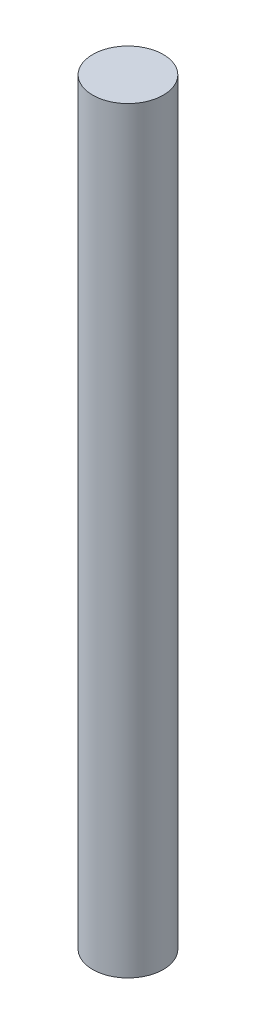
ISO-10303-21;
HEADER;
FILE_DESCRIPTION(('STEP AP214'),'2;1');
FILE_NAME('part.step','',(''),(''),'','','');
FILE_SCHEMA(('AUTOMOTIVE_DESIGN { 1 0 10303 214 1 1 1 1 }'));
ENDSEC;
DATA;
#1=APPLICATION_CONTEXT('core data for automotive mechanical design processes');
#2=APPLICATION_PROTOCOL_DEFINITION('international standard','automotive_design',2000,#1);
#3=PRODUCT_CONTEXT('',#1,'mechanical');
#4=PRODUCT('Part','Part','',(#3));
#5=PRODUCT_RELATED_PRODUCT_CATEGORY('part','',(#4));
#6=PRODUCT_DEFINITION_FORMATION('','',#4);
#7=PRODUCT_DEFINITION_CONTEXT('part definition',#1,'design');
#8=PRODUCT_DEFINITION('design','',#6,#7);
#9=PRODUCT_DEFINITION_SHAPE('','',#8);
#10=(LENGTH_UNIT() NAMED_UNIT(*) SI_UNIT(.MILLI.,.METRE.));
#11=(NAMED_UNIT(*) PLANE_ANGLE_UNIT() SI_UNIT($,.RADIAN.));
#12=(NAMED_UNIT(*) SI_UNIT($,.STERADIAN.) SOLID_ANGLE_UNIT());
#13=UNCERTAINTY_MEASURE_WITH_UNIT(LENGTH_MEASURE(1.E-05),#10,'distance_accuracy_value','');
#14=(GEOMETRIC_REPRESENTATION_CONTEXT(3) GLOBAL_UNCERTAINTY_ASSIGNED_CONTEXT((#13)) GLOBAL_UNIT_ASSIGNED_CONTEXT((#10,
#11,#12)) REPRESENTATION_CONTEXT('',''));
#15=CARTESIAN_POINT('',(0.,0.,0.));
#16=DIRECTION('',(0.,0.,1.));
#17=DIRECTION('',(1.,0.,0.));
#18=AXIS2_PLACEMENT_3D('',#15,#16,#17);
#19=CARTESIAN_POINT('',(0.,32.2,0.));
#20=DIRECTION('',(0.,-1.,0.));
#21=DIRECTION('',(0.,0.,-1.));
#22=AXIS2_PLACEMENT_3D('',#19,#20,#21);
#23=CYLINDRICAL_SURFACE('',#22,1.5);
#24=CARTESIAN_POINT('',(0.,32.2,0.));
#25=DIRECTION('',(0.,1.,0.));
#26=DIRECTION('',(0.,0.,1.));
#27=AXIS2_PLACEMENT_3D('',#24,#25,#26);
#28=CIRCLE('',#27,1.5);
#29=CARTESIAN_POINT('',(0.,32.2,1.5));
#30=VERTEX_POINT('',#29);
#31=EDGE_CURVE('E10',#30,#30,#28,.T.);
#32=ORIENTED_EDGE('',*,*,#31,.F.);
#33=EDGE_LOOP('',(#32));
#34=FACE_BOUND('',#33,.T.);
#35=CARTESIAN_POINT('',(0.,0.,0.));
#36=DIRECTION('',(0.,1.,0.));
#37=DIRECTION('',(0.,0.,1.));
#38=AXIS2_PLACEMENT_3D('',#35,#36,#37);
#39=CIRCLE('',#38,1.5);
#40=CARTESIAN_POINT('',(0.,0.,1.5));
#41=VERTEX_POINT('',#40);
#42=EDGE_CURVE('E34',#41,#41,#39,.T.);
#43=ORIENTED_EDGE('',*,*,#42,.T.);
#44=EDGE_LOOP('',(#43));
#45=FACE_BOUND('',#44,.T.);
#46=ADVANCED_FACE('F31',(#34,#45),#23,.T.);
#47=CARTESIAN_POINT('',(0.,32.2,0.));
#48=DIRECTION('',(0.,1.,0.));
#49=DIRECTION('',(0.,0.,1.));
#50=AXIS2_PLACEMENT_3D('',#47,#48,#49);
#51=PLANE('',#50);
#52=ORIENTED_EDGE('',*,*,#31,.T.);
#53=EDGE_LOOP('',(#52));
#54=FACE_BOUND('',#53,.T.);
#55=ADVANCED_FACE('F46',(#54),#51,.T.);
#56=CARTESIAN_POINT('',(0.,0.,0.));
#57=DIRECTION('',(0.,1.,0.));
#58=DIRECTION('',(0.,0.,1.));
#59=AXIS2_PLACEMENT_3D('',#56,#57,#58);
#60=PLANE('',#59);
#61=ORIENTED_EDGE('',*,*,#42,.F.);
#62=EDGE_LOOP('',(#61));
#63=FACE_BOUND('',#62,.T.);
#64=ADVANCED_FACE('F44',(#63),#60,.F.);
#65=CLOSED_SHELL('',(#46,#55,#64));
#66=MANIFOLD_SOLID_BREP('B2',#65);
#67=ADVANCED_BREP_SHAPE_REPRESENTATION('',(#18,#66),#14);
#68=SHAPE_DEFINITION_REPRESENTATION(#9,#67);
ENDSEC;
END-ISO-10303-21;
